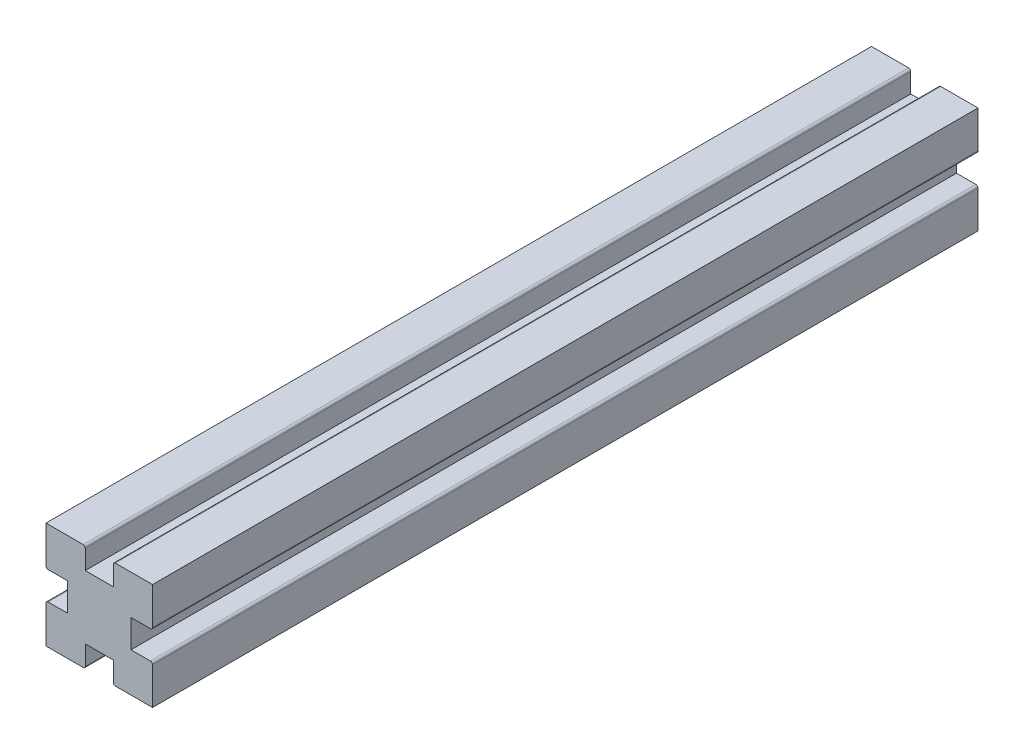
ISO-10303-21;
HEADER;
FILE_DESCRIPTION(('STEP AP214'),'2;1');
FILE_NAME('part.step','',(''),(''),'','','');
FILE_SCHEMA(('AUTOMOTIVE_DESIGN { 1 0 10303 214 1 1 1 1 }'));
ENDSEC;
DATA;
#1=APPLICATION_CONTEXT('core data for automotive mechanical design processes');
#2=APPLICATION_PROTOCOL_DEFINITION('international standard','automotive_design',2000,#1);
#3=PRODUCT_CONTEXT('',#1,'mechanical');
#4=PRODUCT('Part','Part','',(#3));
#5=PRODUCT_RELATED_PRODUCT_CATEGORY('part','',(#4));
#6=PRODUCT_DEFINITION_FORMATION('','',#4);
#7=PRODUCT_DEFINITION_CONTEXT('part definition',#1,'design');
#8=PRODUCT_DEFINITION('design','',#6,#7);
#9=PRODUCT_DEFINITION_SHAPE('','',#8);
#10=(LENGTH_UNIT() NAMED_UNIT(*) SI_UNIT(.MILLI.,.METRE.));
#11=(NAMED_UNIT(*) PLANE_ANGLE_UNIT() SI_UNIT($,.RADIAN.));
#12=(NAMED_UNIT(*) SI_UNIT($,.STERADIAN.) SOLID_ANGLE_UNIT());
#13=UNCERTAINTY_MEASURE_WITH_UNIT(LENGTH_MEASURE(1.E-05),#10,'distance_accuracy_value','');
#14=(GEOMETRIC_REPRESENTATION_CONTEXT(3) GLOBAL_UNCERTAINTY_ASSIGNED_CONTEXT((#13)) GLOBAL_UNIT_ASSIGNED_CONTEXT((#10,
#11,#12)) REPRESENTATION_CONTEXT('',''));
#15=CARTESIAN_POINT('',(0.,0.,0.));
#16=DIRECTION('',(0.,0.,1.));
#17=DIRECTION('',(1.,0.,0.));
#18=AXIS2_PLACEMENT_3D('',#15,#16,#17);
#19=CARTESIAN_POINT('',(-7.56816326530613,0.,196.85));
#20=DIRECTION('',(-1.,0.,0.));
#21=DIRECTION('',(0.,-1.,0.));
#22=AXIS2_PLACEMENT_3D('',#19,#20,#21);
#23=PLANE('',#22);
#24=DIRECTION('',(0.,1.,0.));
#25=VECTOR('',#24,1.);
#26=CARTESIAN_POINT('',(-7.56816326530613,0.,0.));
#27=LINE('',#26,#25);
#28=CARTESIAN_POINT('',(-7.56816326530616,-3.33999999999992,0.));
#29=VERTEX_POINT('',#28);
#30=CARTESIAN_POINT('',(-7.56816326530609,3.34000000000008,0.));
#31=VERTEX_POINT('',#30);
#32=EDGE_CURVE('E242',#29,#31,#27,.T.);
#33=ORIENTED_EDGE('',*,*,#32,.F.);
#34=DIRECTION('',(0.,0.,-1.));
#35=VECTOR('',#34,1.);
#36=CARTESIAN_POINT('',(-7.56816326530616,-3.33999999999992,196.85));
#37=LINE('',#36,#35);
#38=CARTESIAN_POINT('',(-7.56816326530616,-3.33999999999992,196.85));
#39=VERTEX_POINT('',#38);
#40=EDGE_CURVE('E229',#39,#29,#37,.T.);
#41=ORIENTED_EDGE('',*,*,#40,.F.);
#42=DIRECTION('',(0.,1.,0.));
#43=VECTOR('',#42,1.);
#44=CARTESIAN_POINT('',(-7.56816326530613,0.,196.85));
#45=LINE('',#44,#43);
#46=CARTESIAN_POINT('',(-7.56816326530609,3.34000000000008,196.85));
#47=VERTEX_POINT('',#46);
#48=EDGE_CURVE('E236',#39,#47,#45,.T.);
#49=ORIENTED_EDGE('',*,*,#48,.T.);
#50=DIRECTION('',(0.,0.,-1.));
#51=VECTOR('',#50,1.);
#52=CARTESIAN_POINT('',(-7.56816326530609,3.34000000000008,196.85));
#53=LINE('',#52,#51);
#54=EDGE_CURVE('E288',#47,#31,#53,.T.);
#55=ORIENTED_EDGE('',*,*,#54,.T.);
#56=EDGE_LOOP('',(#33,#41,#49,#55));
#57=FACE_BOUND('',#56,.T.);
#58=ADVANCED_FACE('F39',(#57),#23,.T.);
#59=CARTESIAN_POINT('',(0.,-3.34,196.85));
#60=DIRECTION('',(0.,1.,0.));
#61=DIRECTION('',(-1.,0.,0.));
#62=AXIS2_PLACEMENT_3D('',#59,#60,#61);
#63=PLANE('',#62);
#64=DIRECTION('',(1.,0.,0.));
#65=VECTOR('',#64,1.);
#66=CARTESIAN_POINT('',(0.,-3.34,0.));
#67=LINE('',#66,#65);
#68=CARTESIAN_POINT('',(-12.2,-3.33999999999987,0.));
#69=VERTEX_POINT('',#68);
#70=EDGE_CURVE('E290',#69,#29,#67,.T.);
#71=ORIENTED_EDGE('',*,*,#70,.F.);
#72=DIRECTION('',(0.,0.,-1.));
#73=VECTOR('',#72,1.);
#74=CARTESIAN_POINT('',(-12.2,-3.33999999999987,196.85));
#75=LINE('',#74,#73);
#76=CARTESIAN_POINT('',(-12.2,-3.33999999999987,196.85));
#77=VERTEX_POINT('',#76);
#78=EDGE_CURVE('E232',#69,#77,#75,.F.);
#79=ORIENTED_EDGE('',*,*,#78,.T.);
#80=DIRECTION('',(1.,0.,0.));
#81=VECTOR('',#80,1.);
#82=CARTESIAN_POINT('',(0.,-3.34,196.85));
#83=LINE('',#82,#81);
#84=EDGE_CURVE('E225',#77,#39,#83,.T.);
#85=ORIENTED_EDGE('',*,*,#84,.T.);
#86=ORIENTED_EDGE('',*,*,#40,.T.);
#87=EDGE_LOOP('',(#71,#79,#85,#86));
#88=FACE_BOUND('',#87,.T.);
#89=ADVANCED_FACE('F228',(#88),#63,.T.);
#90=CARTESIAN_POINT('',(-12.7,0.,196.85));
#91=DIRECTION('',(1.,0.,0.));
#92=DIRECTION('',(0.,1.,0.));
#93=AXIS2_PLACEMENT_3D('',#90,#91,#92);
#94=PLANE('',#93);
#95=DIRECTION('',(0.,-1.,0.));
#96=VECTOR('',#95,1.);
#97=CARTESIAN_POINT('',(-12.7,0.,196.85));
#98=LINE('',#97,#96);
#99=CARTESIAN_POINT('',(-12.7,-3.83999999999987,196.85));
#100=VERTEX_POINT('',#99);
#101=CARTESIAN_POINT('',(-12.7,-12.7,196.85));
#102=VERTEX_POINT('',#101);
#103=EDGE_CURVE('E235',#100,#102,#98,.T.);
#104=ORIENTED_EDGE('',*,*,#103,.F.);
#105=DIRECTION('',(0.,0.,-1.));
#106=VECTOR('',#105,1.);
#107=CARTESIAN_POINT('',(-12.7,-3.83999999999987,0.));
#108=LINE('',#107,#106);
#109=CARTESIAN_POINT('',(-12.7,-3.83999999999987,0.));
#110=VERTEX_POINT('',#109);
#111=EDGE_CURVE('E395',#100,#110,#108,.T.);
#112=ORIENTED_EDGE('',*,*,#111,.T.);
#113=DIRECTION('',(0.,-1.,0.));
#114=VECTOR('',#113,1.);
#115=CARTESIAN_POINT('',(-12.7,0.,0.));
#116=LINE('',#115,#114);
#117=CARTESIAN_POINT('',(-12.7,-12.7,0.));
#118=VERTEX_POINT('',#117);
#119=EDGE_CURVE('E292',#110,#118,#116,.T.);
#120=ORIENTED_EDGE('',*,*,#119,.T.);
#121=DIRECTION('',(0.,0.,-1.));
#122=VECTOR('',#121,1.);
#123=CARTESIAN_POINT('',(-12.7,-12.7,196.85));
#124=LINE('',#123,#122);
#125=EDGE_CURVE('E244',#102,#118,#124,.T.);
#126=ORIENTED_EDGE('',*,*,#125,.F.);
#127=EDGE_LOOP('',(#104,#112,#120,#126));
#128=FACE_BOUND('',#127,.T.);
#129=ADVANCED_FACE('F512',(#128),#94,.F.);
#130=CARTESIAN_POINT('',(0.,-12.7,196.85));
#131=DIRECTION('',(0.,1.,0.));
#132=DIRECTION('',(0.,0.,1.));
#133=AXIS2_PLACEMENT_3D('',#130,#131,#132);
#134=PLANE('',#133);
#135=DIRECTION('',(1.,0.,0.));
#136=VECTOR('',#135,1.);
#137=CARTESIAN_POINT('',(0.,-12.7,0.));
#138=LINE('',#137,#136);
#139=CARTESIAN_POINT('',(-3.83999999999981,-12.7,0.));
#140=VERTEX_POINT('',#139);
#141=EDGE_CURVE('E294',#118,#140,#138,.T.);
#142=ORIENTED_EDGE('',*,*,#141,.T.);
#143=DIRECTION('',(0.,0.,-1.));
#144=VECTOR('',#143,1.);
#145=CARTESIAN_POINT('',(-3.83999999999981,-12.7,196.85));
#146=LINE('',#145,#144);
#147=CARTESIAN_POINT('',(-3.83999999999981,-12.7,196.85));
#148=VERTEX_POINT('',#147);
#149=EDGE_CURVE('E373',#140,#148,#146,.F.);
#150=ORIENTED_EDGE('',*,*,#149,.T.);
#151=DIRECTION('',(1.,0.,0.));
#152=VECTOR('',#151,1.);
#153=CARTESIAN_POINT('',(0.,-12.7,196.85));
#154=LINE('',#153,#152);
#155=EDGE_CURVE('E256',#102,#148,#154,.T.);
#156=ORIENTED_EDGE('',*,*,#155,.F.);
#157=ORIENTED_EDGE('',*,*,#125,.T.);
#158=EDGE_LOOP('',(#142,#150,#156,#157));
#159=FACE_BOUND('',#158,.T.);
#160=ADVANCED_FACE('F519',(#159),#134,.F.);
#161=CARTESIAN_POINT('',(-3.34000000000046,-1.7782157377853E-13,196.85));
#162=DIRECTION('',(-1.,0.,0.));
#163=DIRECTION('',(0.,-1.,0.));
#164=AXIS2_PLACEMENT_3D('',#161,#162,#163);
#165=PLANE('',#164);
#166=DIRECTION('',(0.,1.,0.));
#167=VECTOR('',#166,1.);
#168=CARTESIAN_POINT('',(-3.34000000000046,-1.7782157377853E-13,196.85));
#169=LINE('',#168,#167);
#170=CARTESIAN_POINT('',(-3.33999999999981,-12.2,196.85));
#171=VERTEX_POINT('',#170);
#172=CARTESIAN_POINT('',(-3.34000000000005,-7.5681632653061,196.85));
#173=VERTEX_POINT('',#172);
#174=EDGE_CURVE('E259',#171,#173,#169,.T.);
#175=ORIENTED_EDGE('',*,*,#174,.F.);
#176=DIRECTION('',(0.,0.,-1.));
#177=VECTOR('',#176,1.);
#178=CARTESIAN_POINT('',(-3.33999999999981,-12.2,196.85));
#179=LINE('',#178,#177);
#180=CARTESIAN_POINT('',(-3.33999999999981,-12.2,0.));
#181=VERTEX_POINT('',#180);
#182=EDGE_CURVE('E243',#171,#181,#179,.T.);
#183=ORIENTED_EDGE('',*,*,#182,.T.);
#184=DIRECTION('',(0.,1.,0.));
#185=VECTOR('',#184,1.);
#186=CARTESIAN_POINT('',(-3.34000000000046,-1.7782157377853E-13,0.));
#187=LINE('',#186,#185);
#188=CARTESIAN_POINT('',(-3.34000000000005,-7.5681632653061,0.));
#189=VERTEX_POINT('',#188);
#190=EDGE_CURVE('E297',#181,#189,#187,.T.);
#191=ORIENTED_EDGE('',*,*,#190,.T.);
#192=DIRECTION('',(0.,0.,-1.));
#193=VECTOR('',#192,1.);
#194=CARTESIAN_POINT('',(-3.34000000000005,-7.5681632653061,196.85));
#195=LINE('',#194,#193);
#196=EDGE_CURVE('E350',#173,#189,#195,.T.);
#197=ORIENTED_EDGE('',*,*,#196,.F.);
#198=EDGE_LOOP('',(#175,#183,#191,#197));
#199=FACE_BOUND('',#198,.T.);
#200=ADVANCED_FACE('F515',(#199),#165,.F.);
#201=CARTESIAN_POINT('',(0.,-7.56816326530607,196.85));
#202=DIRECTION('',(0.,-1.,0.));
#203=DIRECTION('',(1.,0.,0.));
#204=AXIS2_PLACEMENT_3D('',#201,#202,#203);
#205=PLANE('',#204);
#206=DIRECTION('',(-1.,0.,0.));
#207=VECTOR('',#206,1.);
#208=CARTESIAN_POINT('',(0.,-7.56816326530607,0.));
#209=LINE('',#208,#207);
#210=CARTESIAN_POINT('',(3.34000000000022,-7.56816326530604,0.));
#211=VERTEX_POINT('',#210);
#212=EDGE_CURVE('E300',#211,#189,#209,.T.);
#213=ORIENTED_EDGE('',*,*,#212,.F.);
#214=DIRECTION('',(0.,0.,-1.));
#215=VECTOR('',#214,1.);
#216=CARTESIAN_POINT('',(3.34000000000022,-7.56816326530604,196.85));
#217=LINE('',#216,#215);
#218=CARTESIAN_POINT('',(3.34000000000022,-7.56816326530604,196.85));
#219=VERTEX_POINT('',#218);
#220=EDGE_CURVE('E347',#219,#211,#217,.T.);
#221=ORIENTED_EDGE('',*,*,#220,.F.);
#222=DIRECTION('',(-1.,0.,0.));
#223=VECTOR('',#222,1.);
#224=CARTESIAN_POINT('',(0.,-7.56816326530607,196.85));
#225=LINE('',#224,#223);
#226=EDGE_CURVE('E262',#219,#173,#225,.T.);
#227=ORIENTED_EDGE('',*,*,#226,.T.);
#228=ORIENTED_EDGE('',*,*,#196,.T.);
#229=EDGE_LOOP('',(#213,#221,#227,#228));
#230=FACE_BOUND('',#229,.T.);
#231=ADVANCED_FACE('F518',(#230),#205,.T.);
#232=CARTESIAN_POINT('',(3.34000000000022,0.,196.85));
#233=DIRECTION('',(-1.,0.,0.));
#234=DIRECTION('',(0.,-1.,0.));
#235=AXIS2_PLACEMENT_3D('',#232,#233,#234);
#236=PLANE('',#235);
#237=DIRECTION('',(0.,1.,0.));
#238=VECTOR('',#237,1.);
#239=CARTESIAN_POINT('',(3.34000000000022,0.,0.));
#240=LINE('',#239,#238);
#241=CARTESIAN_POINT('',(3.34000000000022,-12.2,0.));
#242=VERTEX_POINT('',#241);
#243=EDGE_CURVE('E303',#242,#211,#240,.T.);
#244=ORIENTED_EDGE('',*,*,#243,.F.);
#245=DIRECTION('',(0.,0.,-1.));
#246=VECTOR('',#245,1.);
#247=CARTESIAN_POINT('',(3.34000000000022,-12.2,196.85));
#248=LINE('',#247,#246);
#249=CARTESIAN_POINT('',(3.34000000000022,-12.2,196.85));
#250=VERTEX_POINT('',#249);
#251=EDGE_CURVE('E393',#242,#250,#248,.F.);
#252=ORIENTED_EDGE('',*,*,#251,.T.);
#253=DIRECTION('',(0.,1.,0.));
#254=VECTOR('',#253,1.);
#255=CARTESIAN_POINT('',(3.34000000000022,0.,196.85));
#256=LINE('',#255,#254);
#257=EDGE_CURVE('E265',#250,#219,#256,.T.);
#258=ORIENTED_EDGE('',*,*,#257,.T.);
#259=ORIENTED_EDGE('',*,*,#220,.T.);
#260=EDGE_LOOP('',(#244,#252,#258,#259));
#261=FACE_BOUND('',#260,.T.);
#262=ADVANCED_FACE('F490',(#261),#236,.T.);
#263=CARTESIAN_POINT('',(3.84000000000022,-12.7,196.85));
#264=VERTEX_POINT('',#263);
#265=CARTESIAN_POINT('',(12.7,-12.7,196.85));
#266=VERTEX_POINT('',#265);
#267=EDGE_CURVE('E260',#264,#266,#154,.T.);
#268=ORIENTED_EDGE('',*,*,#267,.F.);
#269=DIRECTION('',(0.,0.,-1.));
#270=VECTOR('',#269,1.);
#271=CARTESIAN_POINT('',(3.84000000000022,-12.7,0.));
#272=LINE('',#271,#270);
#273=CARTESIAN_POINT('',(3.84000000000022,-12.7,0.));
#274=VERTEX_POINT('',#273);
#275=EDGE_CURVE('E390',#264,#274,#272,.T.);
#276=ORIENTED_EDGE('',*,*,#275,.T.);
#277=CARTESIAN_POINT('',(12.7,-12.7,0.));
#278=VERTEX_POINT('',#277);
#279=EDGE_CURVE('E298',#274,#278,#138,.T.);
#280=ORIENTED_EDGE('',*,*,#279,.T.);
#281=DIRECTION('',(0.,0.,-1.));
#282=VECTOR('',#281,1.);
#283=CARTESIAN_POINT('',(12.7,-12.7,196.85));
#284=LINE('',#283,#282);
#285=EDGE_CURVE('E344',#266,#278,#284,.T.);
#286=ORIENTED_EDGE('',*,*,#285,.F.);
#287=EDGE_LOOP('',(#268,#276,#280,#286));
#288=FACE_BOUND('',#287,.T.);
#289=ADVANCED_FACE('F484',(#288),#134,.F.);
#290=CARTESIAN_POINT('',(12.7,0.,196.85));
#291=DIRECTION('',(1.,0.,0.));
#292=DIRECTION('',(0.,0.,-1.));
#293=AXIS2_PLACEMENT_3D('',#290,#291,#292);
#294=PLANE('',#293);
#295=DIRECTION('',(0.,-1.,0.));
#296=VECTOR('',#295,1.);
#297=CARTESIAN_POINT('',(12.7,0.,0.));
#298=LINE('',#297,#296);
#299=CARTESIAN_POINT('',(12.7,-3.84000000000004,0.));
#300=VERTEX_POINT('',#299);
#301=EDGE_CURVE('E305',#300,#278,#298,.T.);
#302=ORIENTED_EDGE('',*,*,#301,.F.);
#303=DIRECTION('',(0.,0.,-1.));
#304=VECTOR('',#303,1.);
#305=CARTESIAN_POINT('',(12.7,-3.84000000000004,196.85));
#306=LINE('',#305,#304);
#307=CARTESIAN_POINT('',(12.7,-3.84000000000004,196.85));
#308=VERTEX_POINT('',#307);
#309=EDGE_CURVE('E411',#300,#308,#306,.F.);
#310=ORIENTED_EDGE('',*,*,#309,.T.);
#311=DIRECTION('',(0.,-1.,0.));
#312=VECTOR('',#311,1.);
#313=CARTESIAN_POINT('',(12.7,0.,196.85));
#314=LINE('',#313,#312);
#315=EDGE_CURVE('E267',#308,#266,#314,.T.);
#316=ORIENTED_EDGE('',*,*,#315,.T.);
#317=ORIENTED_EDGE('',*,*,#285,.T.);
#318=EDGE_LOOP('',(#302,#310,#316,#317));
#319=FACE_BOUND('',#318,.T.);
#320=ADVANCED_FACE('F476',(#319),#294,.T.);
#321=CARTESIAN_POINT('',(0.,-3.34,196.85));
#322=DIRECTION('',(0.,-1.,0.));
#323=DIRECTION('',(1.,0.,0.));
#324=AXIS2_PLACEMENT_3D('',#321,#322,#323);
#325=PLANE('',#324);
#326=DIRECTION('',(-1.,0.,0.));
#327=VECTOR('',#326,1.);
#328=CARTESIAN_POINT('',(0.,-3.34,196.85));
#329=LINE('',#328,#327);
#330=CARTESIAN_POINT('',(12.2,-3.34000000000004,196.85));
#331=VERTEX_POINT('',#330);
#332=CARTESIAN_POINT('',(7.56816326530612,-3.34000000000003,196.85));
#333=VERTEX_POINT('',#332);
#334=EDGE_CURVE('E269',#331,#333,#329,.T.);
#335=ORIENTED_EDGE('',*,*,#334,.F.);
#336=DIRECTION('',(0.,0.,-1.));
#337=VECTOR('',#336,1.);
#338=CARTESIAN_POINT('',(12.2,-3.34000000000004,0.));
#339=LINE('',#338,#337);
#340=CARTESIAN_POINT('',(12.2,-3.34000000000004,0.));
#341=VERTEX_POINT('',#340);
#342=EDGE_CURVE('E408',#331,#341,#339,.T.);
#343=ORIENTED_EDGE('',*,*,#342,.T.);
#344=DIRECTION('',(-1.,0.,0.));
#345=VECTOR('',#344,1.);
#346=CARTESIAN_POINT('',(0.,-3.34,0.));
#347=LINE('',#346,#345);
#348=CARTESIAN_POINT('',(7.56816326530612,-3.34000000000003,0.));
#349=VERTEX_POINT('',#348);
#350=EDGE_CURVE('E308',#341,#349,#347,.T.);
#351=ORIENTED_EDGE('',*,*,#350,.T.);
#352=DIRECTION('',(0.,0.,-1.));
#353=VECTOR('',#352,1.);
#354=CARTESIAN_POINT('',(7.56816326530612,-3.34000000000003,196.85));
#355=LINE('',#354,#353);
#356=EDGE_CURVE('E341',#333,#349,#355,.T.);
#357=ORIENTED_EDGE('',*,*,#356,.F.);
#358=EDGE_LOOP('',(#335,#343,#351,#357));
#359=FACE_BOUND('',#358,.T.);
#360=ADVANCED_FACE('F468',(#359),#325,.F.);
#361=CARTESIAN_POINT('',(7.56816326530613,0.,196.85));
#362=DIRECTION('',(1.,0.,0.));
#363=DIRECTION('',(0.,1.,0.));
#364=AXIS2_PLACEMENT_3D('',#361,#362,#363);
#365=PLANE('',#364);
#366=DIRECTION('',(0.,-1.,0.));
#367=VECTOR('',#366,1.);
#368=CARTESIAN_POINT('',(7.56816326530613,0.,0.));
#369=LINE('',#368,#367);
#370=CARTESIAN_POINT('',(7.56816326530614,3.33999999999997,0.));
#371=VERTEX_POINT('',#370);
#372=EDGE_CURVE('E311',#371,#349,#369,.T.);
#373=ORIENTED_EDGE('',*,*,#372,.F.);
#374=DIRECTION('',(0.,0.,-1.));
#375=VECTOR('',#374,1.);
#376=CARTESIAN_POINT('',(7.56816326530614,3.33999999999997,196.85));
#377=LINE('',#376,#375);
#378=CARTESIAN_POINT('',(7.56816326530614,3.33999999999997,196.85));
#379=VERTEX_POINT('',#378);
#380=EDGE_CURVE('E338',#379,#371,#377,.T.);
#381=ORIENTED_EDGE('',*,*,#380,.F.);
#382=DIRECTION('',(0.,-1.,0.));
#383=VECTOR('',#382,1.);
#384=CARTESIAN_POINT('',(7.56816326530613,0.,196.85));
#385=LINE('',#384,#383);
#386=EDGE_CURVE('E272',#379,#333,#385,.T.);
#387=ORIENTED_EDGE('',*,*,#386,.T.);
#388=ORIENTED_EDGE('',*,*,#356,.T.);
#389=EDGE_LOOP('',(#373,#381,#387,#388));
#390=FACE_BOUND('',#389,.T.);
#391=ADVANCED_FACE('F464',(#390),#365,.T.);
#392=CARTESIAN_POINT('',(0.,3.34,196.85));
#393=DIRECTION('',(0.,-1.,0.));
#394=DIRECTION('',(1.,0.,0.));
#395=AXIS2_PLACEMENT_3D('',#392,#393,#394);
#396=PLANE('',#395);
#397=DIRECTION('',(-1.,0.,0.));
#398=VECTOR('',#397,1.);
#399=CARTESIAN_POINT('',(0.,3.34,0.));
#400=LINE('',#399,#398);
#401=CARTESIAN_POINT('',(12.2,3.33999999999996,0.));
#402=VERTEX_POINT('',#401);
#403=EDGE_CURVE('E314',#402,#371,#400,.T.);
#404=ORIENTED_EDGE('',*,*,#403,.F.);
#405=DIRECTION('',(0.,0.,-1.));
#406=VECTOR('',#405,1.);
#407=CARTESIAN_POINT('',(12.2,3.33999999999996,196.85));
#408=LINE('',#407,#406);
#409=CARTESIAN_POINT('',(12.2,3.33999999999996,196.85));
#410=VERTEX_POINT('',#409);
#411=EDGE_CURVE('E406',#402,#410,#408,.F.);
#412=ORIENTED_EDGE('',*,*,#411,.T.);
#413=DIRECTION('',(-1.,0.,0.));
#414=VECTOR('',#413,1.);
#415=CARTESIAN_POINT('',(0.,3.34,196.85));
#416=LINE('',#415,#414);
#417=EDGE_CURVE('E275',#410,#379,#416,.T.);
#418=ORIENTED_EDGE('',*,*,#417,.T.);
#419=ORIENTED_EDGE('',*,*,#380,.T.);
#420=EDGE_LOOP('',(#404,#412,#418,#419));
#421=FACE_BOUND('',#420,.T.);
#422=ADVANCED_FACE('F457',(#421),#396,.T.);
#423=CARTESIAN_POINT('',(12.7,12.7,196.85));
#424=VERTEX_POINT('',#423);
#425=CARTESIAN_POINT('',(12.7,3.83999999999996,196.85));
#426=VERTEX_POINT('',#425);
#427=EDGE_CURVE('E270',#424,#426,#314,.T.);
#428=ORIENTED_EDGE('',*,*,#427,.T.);
#429=DIRECTION('',(0.,0.,-1.));
#430=VECTOR('',#429,1.);
#431=CARTESIAN_POINT('',(12.7,3.83999999999996,196.85));
#432=LINE('',#431,#430);
#433=CARTESIAN_POINT('',(12.7,3.83999999999996,0.));
#434=VERTEX_POINT('',#433);
#435=EDGE_CURVE('E403',#426,#434,#432,.T.);
#436=ORIENTED_EDGE('',*,*,#435,.T.);
#437=CARTESIAN_POINT('',(12.7,12.7,0.));
#438=VERTEX_POINT('',#437);
#439=EDGE_CURVE('E309',#438,#434,#298,.T.);
#440=ORIENTED_EDGE('',*,*,#439,.F.);
#441=DIRECTION('',(0.,0.,-1.));
#442=VECTOR('',#441,1.);
#443=CARTESIAN_POINT('',(12.7,12.7,196.85));
#444=LINE('',#443,#442);
#445=EDGE_CURVE('E335',#424,#438,#444,.T.);
#446=ORIENTED_EDGE('',*,*,#445,.F.);
#447=EDGE_LOOP('',(#428,#436,#440,#446));
#448=FACE_BOUND('',#447,.T.);
#449=ADVANCED_FACE('F449',(#448),#294,.T.);
#450=CARTESIAN_POINT('',(0.,12.7,196.85));
#451=DIRECTION('',(0.,1.,0.));
#452=DIRECTION('',(0.,0.,1.));
#453=AXIS2_PLACEMENT_3D('',#450,#451,#452);
#454=PLANE('',#453);
#455=DIRECTION('',(1.,0.,0.));
#456=VECTOR('',#455,1.);
#457=CARTESIAN_POINT('',(0.,12.7,0.));
#458=LINE('',#457,#456);
#459=CARTESIAN_POINT('',(3.84,12.7,0.));
#460=VERTEX_POINT('',#459);
#461=EDGE_CURVE('E316',#460,#438,#458,.T.);
#462=ORIENTED_EDGE('',*,*,#461,.F.);
#463=DIRECTION('',(0.,0.,-1.));
#464=VECTOR('',#463,1.);
#465=CARTESIAN_POINT('',(3.84,12.7,196.85));
#466=LINE('',#465,#464);
#467=CARTESIAN_POINT('',(3.84,12.7,196.85));
#468=VERTEX_POINT('',#467);
#469=EDGE_CURVE('E11',#460,#468,#466,.F.);
#470=ORIENTED_EDGE('',*,*,#469,.T.);
#471=DIRECTION('',(1.,0.,0.));
#472=VECTOR('',#471,1.);
#473=CARTESIAN_POINT('',(0.,12.7,196.85));
#474=LINE('',#473,#472);
#475=EDGE_CURVE('E277',#468,#424,#474,.T.);
#476=ORIENTED_EDGE('',*,*,#475,.T.);
#477=ORIENTED_EDGE('',*,*,#445,.T.);
#478=EDGE_LOOP('',(#462,#470,#476,#477));
#479=FACE_BOUND('',#478,.T.);
#480=ADVANCED_FACE('F442',(#479),#454,.T.);
#481=CARTESIAN_POINT('',(3.34,0.,196.85));
#482=DIRECTION('',(1.,0.,0.));
#483=DIRECTION('',(0.,1.,0.));
#484=AXIS2_PLACEMENT_3D('',#481,#482,#483);
#485=PLANE('',#484);
#486=DIRECTION('',(0.,-1.,0.));
#487=VECTOR('',#486,1.);
#488=CARTESIAN_POINT('',(3.34,0.,196.85));
#489=LINE('',#488,#487);
#490=CARTESIAN_POINT('',(3.34,12.2,196.85));
#491=VERTEX_POINT('',#490);
#492=CARTESIAN_POINT('',(3.34,7.56816326530613,196.85));
#493=VERTEX_POINT('',#492);
#494=EDGE_CURVE('E279',#491,#493,#489,.T.);
#495=ORIENTED_EDGE('',*,*,#494,.F.);
#496=DIRECTION('',(0.,0.,-1.));
#497=VECTOR('',#496,1.);
#498=CARTESIAN_POINT('',(3.34,12.2,0.));
#499=LINE('',#498,#497);
#500=CARTESIAN_POINT('',(3.34,12.2,0.));
#501=VERTEX_POINT('',#500);
#502=EDGE_CURVE('E47',#491,#501,#499,.T.);
#503=ORIENTED_EDGE('',*,*,#502,.T.);
#504=DIRECTION('',(0.,-1.,0.));
#505=VECTOR('',#504,1.);
#506=CARTESIAN_POINT('',(3.34,0.,0.));
#507=LINE('',#506,#505);
#508=CARTESIAN_POINT('',(3.34,7.56816326530613,0.));
#509=VERTEX_POINT('',#508);
#510=EDGE_CURVE('E318',#501,#509,#507,.T.);
#511=ORIENTED_EDGE('',*,*,#510,.T.);
#512=DIRECTION('',(0.,0.,-1.));
#513=VECTOR('',#512,1.);
#514=CARTESIAN_POINT('',(3.34,7.56816326530613,196.85));
#515=LINE('',#514,#513);
#516=EDGE_CURVE('E332',#493,#509,#515,.T.);
#517=ORIENTED_EDGE('',*,*,#516,.F.);
#518=EDGE_LOOP('',(#495,#503,#511,#517));
#519=FACE_BOUND('',#518,.T.);
#520=ADVANCED_FACE('F422',(#519),#485,.F.);
#521=CARTESIAN_POINT('',(0.,7.56816326530613,196.85));
#522=DIRECTION('',(0.,1.,0.));
#523=DIRECTION('',(-1.,0.,0.));
#524=AXIS2_PLACEMENT_3D('',#521,#522,#523);
#525=PLANE('',#524);
#526=DIRECTION('',(1.,0.,0.));
#527=VECTOR('',#526,1.);
#528=CARTESIAN_POINT('',(0.,7.56816326530613,0.));
#529=LINE('',#528,#527);
#530=CARTESIAN_POINT('',(-3.34,7.56816326530613,0.));
#531=VERTEX_POINT('',#530);
#532=EDGE_CURVE('E321',#531,#509,#529,.T.);
#533=ORIENTED_EDGE('',*,*,#532,.F.);
#534=DIRECTION('',(0.,0.,-1.));
#535=VECTOR('',#534,1.);
#536=CARTESIAN_POINT('',(-3.34,7.56816326530613,196.85));
#537=LINE('',#536,#535);
#538=CARTESIAN_POINT('',(-3.34,7.56816326530613,196.85));
#539=VERTEX_POINT('',#538);
#540=EDGE_CURVE('E329',#539,#531,#537,.T.);
#541=ORIENTED_EDGE('',*,*,#540,.F.);
#542=DIRECTION('',(1.,0.,0.));
#543=VECTOR('',#542,1.);
#544=CARTESIAN_POINT('',(0.,7.56816326530613,196.85));
#545=LINE('',#544,#543);
#546=EDGE_CURVE('E282',#539,#493,#545,.T.);
#547=ORIENTED_EDGE('',*,*,#546,.T.);
#548=ORIENTED_EDGE('',*,*,#516,.T.);
#549=EDGE_LOOP('',(#533,#541,#547,#548));
#550=FACE_BOUND('',#549,.T.);
#551=ADVANCED_FACE('F434',(#550),#525,.T.);
#552=CARTESIAN_POINT('',(-3.34,0.,196.85));
#553=DIRECTION('',(1.,0.,0.));
#554=DIRECTION('',(0.,1.,0.));
#555=AXIS2_PLACEMENT_3D('',#552,#553,#554);
#556=PLANE('',#555);
#557=DIRECTION('',(0.,-1.,0.));
#558=VECTOR('',#557,1.);
#559=CARTESIAN_POINT('',(-3.34,0.,0.));
#560=LINE('',#559,#558);
#561=CARTESIAN_POINT('',(-3.34,12.2,0.));
#562=VERTEX_POINT('',#561);
#563=EDGE_CURVE('E324',#562,#531,#560,.T.);
#564=ORIENTED_EDGE('',*,*,#563,.F.);
#565=DIRECTION('',(0.,0.,-1.));
#566=VECTOR('',#565,1.);
#567=CARTESIAN_POINT('',(-3.34,12.2,196.85));
#568=LINE('',#567,#566);
#569=CARTESIAN_POINT('',(-3.34,12.2,196.85));
#570=VERTEX_POINT('',#569);
#571=EDGE_CURVE('E416',#562,#570,#568,.F.);
#572=ORIENTED_EDGE('',*,*,#571,.T.);
#573=DIRECTION('',(0.,-1.,0.));
#574=VECTOR('',#573,1.);
#575=CARTESIAN_POINT('',(-3.34,0.,196.85));
#576=LINE('',#575,#574);
#577=EDGE_CURVE('E285',#570,#539,#576,.T.);
#578=ORIENTED_EDGE('',*,*,#577,.T.);
#579=ORIENTED_EDGE('',*,*,#540,.T.);
#580=EDGE_LOOP('',(#564,#572,#578,#579));
#581=FACE_BOUND('',#580,.T.);
#582=ADVANCED_FACE('F540',(#581),#556,.T.);
#583=CARTESIAN_POINT('',(-12.7,12.7,196.85));
#584=VERTEX_POINT('',#583);
#585=CARTESIAN_POINT('',(-3.84,12.7,196.85));
#586=VERTEX_POINT('',#585);
#587=EDGE_CURVE('E280',#584,#586,#474,.T.);
#588=ORIENTED_EDGE('',*,*,#587,.T.);
#589=DIRECTION('',(0.,0.,-1.));
#590=VECTOR('',#589,1.);
#591=CARTESIAN_POINT('',(-3.84,12.7,196.85));
#592=LINE('',#591,#590);
#593=CARTESIAN_POINT('',(-3.84,12.7,0.));
#594=VERTEX_POINT('',#593);
#595=EDGE_CURVE('E413',#586,#594,#592,.T.);
#596=ORIENTED_EDGE('',*,*,#595,.T.);
#597=CARTESIAN_POINT('',(-12.7,12.7,0.));
#598=VERTEX_POINT('',#597);
#599=EDGE_CURVE('E319',#598,#594,#458,.T.);
#600=ORIENTED_EDGE('',*,*,#599,.F.);
#601=DIRECTION('',(0.,0.,-1.));
#602=VECTOR('',#601,1.);
#603=CARTESIAN_POINT('',(-12.7,12.7,196.85));
#604=LINE('',#603,#602);
#605=EDGE_CURVE('E327',#584,#598,#604,.T.);
#606=ORIENTED_EDGE('',*,*,#605,.F.);
#607=EDGE_LOOP('',(#588,#596,#600,#606));
#608=FACE_BOUND('',#607,.T.);
#609=ADVANCED_FACE('F543',(#608),#454,.T.);
#610=CARTESIAN_POINT('',(-12.7,3.84000000000013,0.));
#611=VERTEX_POINT('',#610);
#612=EDGE_CURVE('E252',#598,#611,#116,.T.);
#613=ORIENTED_EDGE('',*,*,#612,.T.);
#614=DIRECTION('',(0.,0.,-1.));
#615=VECTOR('',#614,1.);
#616=CARTESIAN_POINT('',(-12.7,3.84000000000013,196.85));
#617=LINE('',#616,#615);
#618=CARTESIAN_POINT('',(-12.7,3.84000000000013,196.85));
#619=VERTEX_POINT('',#618);
#620=EDGE_CURVE('E62',#611,#619,#617,.F.);
#621=ORIENTED_EDGE('',*,*,#620,.T.);
#622=EDGE_CURVE('E257',#584,#619,#98,.T.);
#623=ORIENTED_EDGE('',*,*,#622,.F.);
#624=ORIENTED_EDGE('',*,*,#605,.T.);
#625=EDGE_LOOP('',(#613,#621,#623,#624));
#626=FACE_BOUND('',#625,.T.);
#627=ADVANCED_FACE('F547',(#626),#94,.F.);
#628=CARTESIAN_POINT('',(0.,3.34,196.85));
#629=DIRECTION('',(0.,1.,0.));
#630=DIRECTION('',(-1.,0.,0.));
#631=AXIS2_PLACEMENT_3D('',#628,#629,#630);
#632=PLANE('',#631);
#633=DIRECTION('',(1.,0.,0.));
#634=VECTOR('',#633,1.);
#635=CARTESIAN_POINT('',(0.,3.34,196.85));
#636=LINE('',#635,#634);
#637=CARTESIAN_POINT('',(-12.2,3.34000000000013,196.85));
#638=VERTEX_POINT('',#637);
#639=EDGE_CURVE('E248',#638,#47,#636,.T.);
#640=ORIENTED_EDGE('',*,*,#639,.F.);
#641=DIRECTION('',(0.,0.,-1.));
#642=VECTOR('',#641,1.);
#643=CARTESIAN_POINT('',(-12.2,3.34000000000013,196.85));
#644=LINE('',#643,#642);
#645=CARTESIAN_POINT('',(-12.2,3.34000000000013,0.));
#646=VERTEX_POINT('',#645);
#647=EDGE_CURVE('E399',#638,#646,#644,.T.);
#648=ORIENTED_EDGE('',*,*,#647,.T.);
#649=DIRECTION('',(1.,0.,0.));
#650=VECTOR('',#649,1.);
#651=CARTESIAN_POINT('',(0.,3.34,0.));
#652=LINE('',#651,#650);
#653=EDGE_CURVE('E250',#646,#31,#652,.T.);
#654=ORIENTED_EDGE('',*,*,#653,.T.);
#655=ORIENTED_EDGE('',*,*,#54,.F.);
#656=EDGE_LOOP('',(#640,#648,#654,#655));
#657=FACE_BOUND('',#656,.T.);
#658=ADVANCED_FACE('F551',(#657),#632,.F.);
#659=CARTESIAN_POINT('',(0.,0.,196.85));
#660=DIRECTION('',(0.,0.,1.));
#661=DIRECTION('',(1.,0.,0.));
#662=AXIS2_PLACEMENT_3D('',#659,#660,#661);
#663=PLANE('',#662);
#664=ORIENTED_EDGE('',*,*,#155,.T.);
#665=CARTESIAN_POINT('',(-3.83999999999981,-12.2,196.85));
#666=DIRECTION('',(0.,0.,1.));
#667=DIRECTION('',(1.,0.,0.));
#668=AXIS2_PLACEMENT_3D('',#665,#666,#667);
#669=CIRCLE('',#668,0.5);
#670=EDGE_CURVE('E388',#148,#171,#669,.T.);
#671=ORIENTED_EDGE('',*,*,#670,.T.);
#672=ORIENTED_EDGE('',*,*,#174,.T.);
#673=ORIENTED_EDGE('',*,*,#226,.F.);
#674=ORIENTED_EDGE('',*,*,#257,.F.);
#675=CARTESIAN_POINT('',(3.84000000000022,-12.2,196.85));
#676=DIRECTION('',(0.,0.,1.));
#677=DIRECTION('',(1.,0.,0.));
#678=AXIS2_PLACEMENT_3D('',#675,#676,#677);
#679=CIRCLE('',#678,0.5);
#680=EDGE_CURVE('E386',#250,#264,#679,.T.);
#681=ORIENTED_EDGE('',*,*,#680,.T.);
#682=ORIENTED_EDGE('',*,*,#267,.T.);
#683=ORIENTED_EDGE('',*,*,#315,.F.);
#684=CARTESIAN_POINT('',(12.2,-3.84000000000004,196.85));
#685=DIRECTION('',(0.,0.,1.));
#686=DIRECTION('',(1.,0.,0.));
#687=AXIS2_PLACEMENT_3D('',#684,#685,#686);
#688=CIRCLE('',#687,0.5);
#689=EDGE_CURVE('E379',#308,#331,#688,.T.);
#690=ORIENTED_EDGE('',*,*,#689,.T.);
#691=ORIENTED_EDGE('',*,*,#334,.T.);
#692=ORIENTED_EDGE('',*,*,#386,.F.);
#693=ORIENTED_EDGE('',*,*,#417,.F.);
#694=CARTESIAN_POINT('',(12.2,3.83999999999996,196.85));
#695=DIRECTION('',(0.,0.,1.));
#696=DIRECTION('',(1.,0.,0.));
#697=AXIS2_PLACEMENT_3D('',#694,#695,#696);
#698=CIRCLE('',#697,0.5);
#699=EDGE_CURVE('E381',#410,#426,#698,.T.);
#700=ORIENTED_EDGE('',*,*,#699,.T.);
#701=ORIENTED_EDGE('',*,*,#427,.F.);
#702=ORIENTED_EDGE('',*,*,#475,.F.);
#703=CARTESIAN_POINT('',(3.84,12.2,196.85));
#704=DIRECTION('',(0.,0.,1.));
#705=DIRECTION('',(1.,0.,0.));
#706=AXIS2_PLACEMENT_3D('',#703,#704,#705);
#707=CIRCLE('',#706,0.5);
#708=EDGE_CURVE('E375',#468,#491,#707,.T.);
#709=ORIENTED_EDGE('',*,*,#708,.T.);
#710=ORIENTED_EDGE('',*,*,#494,.T.);
#711=ORIENTED_EDGE('',*,*,#546,.F.);
#712=ORIENTED_EDGE('',*,*,#577,.F.);
#713=CARTESIAN_POINT('',(-3.84,12.2,196.85));
#714=DIRECTION('',(0.,0.,1.));
#715=DIRECTION('',(1.,0.,0.));
#716=AXIS2_PLACEMENT_3D('',#713,#714,#715);
#717=CIRCLE('',#716,0.5);
#718=EDGE_CURVE('E377',#570,#586,#717,.T.);
#719=ORIENTED_EDGE('',*,*,#718,.T.);
#720=ORIENTED_EDGE('',*,*,#587,.F.);
#721=ORIENTED_EDGE('',*,*,#622,.T.);
#722=CARTESIAN_POINT('',(-12.2,3.84000000000013,196.85));
#723=DIRECTION('',(0.,0.,1.));
#724=DIRECTION('',(1.,0.,0.));
#725=AXIS2_PLACEMENT_3D('',#722,#723,#724);
#726=CIRCLE('',#725,0.5);
#727=EDGE_CURVE('E54',#619,#638,#726,.T.);
#728=ORIENTED_EDGE('',*,*,#727,.T.);
#729=ORIENTED_EDGE('',*,*,#639,.T.);
#730=ORIENTED_EDGE('',*,*,#48,.F.);
#731=ORIENTED_EDGE('',*,*,#84,.F.);
#732=CARTESIAN_POINT('',(-12.2,-3.83999999999987,196.85));
#733=DIRECTION('',(0.,0.,1.));
#734=DIRECTION('',(1.,0.,0.));
#735=AXIS2_PLACEMENT_3D('',#732,#733,#734);
#736=CIRCLE('',#735,0.5);
#737=EDGE_CURVE('E384',#77,#100,#736,.T.);
#738=ORIENTED_EDGE('',*,*,#737,.T.);
#739=ORIENTED_EDGE('',*,*,#103,.T.);
#740=EDGE_LOOP('',(#664,#671,#672,#673,#674,#681,#682,#683,#690,#691,#692,#693,#700,#701,#702,
#709,#710,#711,#712,#719,#720,#721,#728,#729,#730,#731,#738,#739));
#741=FACE_BOUND('',#740,.T.);
#742=ADVANCED_FACE('F247',(#741),#663,.T.);
#743=CARTESIAN_POINT('',(0.,0.,0.));
#744=DIRECTION('',(0.,0.,1.));
#745=DIRECTION('',(1.,0.,0.));
#746=AXIS2_PLACEMENT_3D('',#743,#744,#745);
#747=PLANE('',#746);
#748=ORIENTED_EDGE('',*,*,#190,.F.);
#749=CARTESIAN_POINT('',(-3.83999999999981,-12.2,0.));
#750=DIRECTION('',(0.,0.,1.));
#751=DIRECTION('',(1.,0.,0.));
#752=AXIS2_PLACEMENT_3D('',#749,#750,#751);
#753=CIRCLE('',#752,0.5);
#754=EDGE_CURVE('E371',#181,#140,#753,.F.);
#755=ORIENTED_EDGE('',*,*,#754,.T.);
#756=ORIENTED_EDGE('',*,*,#141,.F.);
#757=ORIENTED_EDGE('',*,*,#119,.F.);
#758=CARTESIAN_POINT('',(-12.2,-3.83999999999987,0.));
#759=DIRECTION('',(0.,0.,1.));
#760=DIRECTION('',(1.,0.,0.));
#761=AXIS2_PLACEMENT_3D('',#758,#759,#760);
#762=CIRCLE('',#761,0.5);
#763=EDGE_CURVE('E367',#110,#69,#762,.F.);
#764=ORIENTED_EDGE('',*,*,#763,.T.);
#765=ORIENTED_EDGE('',*,*,#70,.T.);
#766=ORIENTED_EDGE('',*,*,#32,.T.);
#767=ORIENTED_EDGE('',*,*,#653,.F.);
#768=CARTESIAN_POINT('',(-12.2,3.84000000000013,0.));
#769=DIRECTION('',(0.,0.,1.));
#770=DIRECTION('',(1.,0.,0.));
#771=AXIS2_PLACEMENT_3D('',#768,#769,#770);
#772=CIRCLE('',#771,0.5);
#773=EDGE_CURVE('E365',#646,#611,#772,.F.);
#774=ORIENTED_EDGE('',*,*,#773,.T.);
#775=ORIENTED_EDGE('',*,*,#612,.F.);
#776=ORIENTED_EDGE('',*,*,#599,.T.);
#777=CARTESIAN_POINT('',(-3.84,12.2,0.));
#778=DIRECTION('',(0.,0.,1.));
#779=DIRECTION('',(1.,0.,0.));
#780=AXIS2_PLACEMENT_3D('',#777,#778,#779);
#781=CIRCLE('',#780,0.5);
#782=EDGE_CURVE('E359',#594,#562,#781,.F.);
#783=ORIENTED_EDGE('',*,*,#782,.T.);
#784=ORIENTED_EDGE('',*,*,#563,.T.);
#785=ORIENTED_EDGE('',*,*,#532,.T.);
#786=ORIENTED_EDGE('',*,*,#510,.F.);
#787=CARTESIAN_POINT('',(3.84,12.2,0.));
#788=DIRECTION('',(0.,0.,1.));
#789=DIRECTION('',(1.,0.,0.));
#790=AXIS2_PLACEMENT_3D('',#787,#788,#789);
#791=CIRCLE('',#790,0.5);
#792=EDGE_CURVE('E357',#501,#460,#791,.F.);
#793=ORIENTED_EDGE('',*,*,#792,.T.);
#794=ORIENTED_EDGE('',*,*,#461,.T.);
#795=ORIENTED_EDGE('',*,*,#439,.T.);
#796=CARTESIAN_POINT('',(12.2,3.83999999999996,0.));
#797=DIRECTION('',(0.,0.,1.));
#798=DIRECTION('',(1.,0.,0.));
#799=AXIS2_PLACEMENT_3D('',#796,#797,#798);
#800=CIRCLE('',#799,0.5);
#801=EDGE_CURVE('E363',#434,#402,#800,.F.);
#802=ORIENTED_EDGE('',*,*,#801,.T.);
#803=ORIENTED_EDGE('',*,*,#403,.T.);
#804=ORIENTED_EDGE('',*,*,#372,.T.);
#805=ORIENTED_EDGE('',*,*,#350,.F.);
#806=CARTESIAN_POINT('',(12.2,-3.84000000000004,0.));
#807=DIRECTION('',(0.,0.,1.));
#808=DIRECTION('',(1.,0.,0.));
#809=AXIS2_PLACEMENT_3D('',#806,#807,#808);
#810=CIRCLE('',#809,0.5);
#811=EDGE_CURVE('E361',#341,#300,#810,.F.);
#812=ORIENTED_EDGE('',*,*,#811,.T.);
#813=ORIENTED_EDGE('',*,*,#301,.T.);
#814=ORIENTED_EDGE('',*,*,#279,.F.);
#815=CARTESIAN_POINT('',(3.84000000000022,-12.2,0.));
#816=DIRECTION('',(0.,0.,1.));
#817=DIRECTION('',(1.,0.,0.));
#818=AXIS2_PLACEMENT_3D('',#815,#816,#817);
#819=CIRCLE('',#818,0.5);
#820=EDGE_CURVE('E369',#274,#242,#819,.F.);
#821=ORIENTED_EDGE('',*,*,#820,.T.);
#822=ORIENTED_EDGE('',*,*,#243,.T.);
#823=ORIENTED_EDGE('',*,*,#212,.T.);
#824=EDGE_LOOP('',(#748,#755,#756,#757,#764,#765,#766,#767,#774,#775,#776,#783,#784,#785,#786,
#793,#794,#795,#802,#803,#804,#805,#812,#813,#814,#821,#822,#823));
#825=FACE_BOUND('',#824,.T.);
#826=ADVANCED_FACE('F428',(#825),#747,.F.);
#827=CARTESIAN_POINT('',(-3.83999999999981,-12.2,196.85));
#828=DIRECTION('',(0.,0.,-1.));
#829=DIRECTION('',(-1.,0.,0.));
#830=AXIS2_PLACEMENT_3D('',#827,#828,#829);
#831=CYLINDRICAL_SURFACE('',#830,0.5);
#832=ORIENTED_EDGE('',*,*,#670,.F.);
#833=ORIENTED_EDGE('',*,*,#149,.F.);
#834=ORIENTED_EDGE('',*,*,#754,.F.);
#835=ORIENTED_EDGE('',*,*,#182,.F.);
#836=EDGE_LOOP('',(#832,#833,#834,#835));
#837=FACE_BOUND('',#836,.T.);
#838=ADVANCED_FACE('F496',(#837),#831,.T.);
#839=CARTESIAN_POINT('',(3.84000000000022,-12.2,196.85));
#840=DIRECTION('',(0.,0.,1.));
#841=DIRECTION('',(1.,0.,0.));
#842=AXIS2_PLACEMENT_3D('',#839,#840,#841);
#843=CYLINDRICAL_SURFACE('',#842,0.5);
#844=ORIENTED_EDGE('',*,*,#680,.F.);
#845=ORIENTED_EDGE('',*,*,#251,.F.);
#846=ORIENTED_EDGE('',*,*,#820,.F.);
#847=ORIENTED_EDGE('',*,*,#275,.F.);
#848=EDGE_LOOP('',(#844,#845,#846,#847));
#849=FACE_BOUND('',#848,.T.);
#850=ADVANCED_FACE('F493',(#849),#843,.T.);
#851=CARTESIAN_POINT('',(-12.2,-3.83999999999987,196.85));
#852=DIRECTION('',(0.,0.,1.));
#853=DIRECTION('',(1.,0.,0.));
#854=AXIS2_PLACEMENT_3D('',#851,#852,#853);
#855=CYLINDRICAL_SURFACE('',#854,0.5);
#856=ORIENTED_EDGE('',*,*,#737,.F.);
#857=ORIENTED_EDGE('',*,*,#78,.F.);
#858=ORIENTED_EDGE('',*,*,#763,.F.);
#859=ORIENTED_EDGE('',*,*,#111,.F.);
#860=EDGE_LOOP('',(#856,#857,#858,#859));
#861=FACE_BOUND('',#860,.T.);
#862=ADVANCED_FACE('F495',(#861),#855,.T.);
#863=CARTESIAN_POINT('',(-12.2,3.84000000000013,196.85));
#864=DIRECTION('',(0.,0.,-1.));
#865=DIRECTION('',(-1.,0.,0.));
#866=AXIS2_PLACEMENT_3D('',#863,#864,#865);
#867=CYLINDRICAL_SURFACE('',#866,0.5);
#868=ORIENTED_EDGE('',*,*,#727,.F.);
#869=ORIENTED_EDGE('',*,*,#620,.F.);
#870=ORIENTED_EDGE('',*,*,#773,.F.);
#871=ORIENTED_EDGE('',*,*,#647,.F.);
#872=EDGE_LOOP('',(#868,#869,#870,#871));
#873=FACE_BOUND('',#872,.T.);
#874=ADVANCED_FACE('F502',(#873),#867,.T.);
#875=CARTESIAN_POINT('',(12.2,3.83999999999996,196.85));
#876=DIRECTION('',(0.,0.,-1.));
#877=DIRECTION('',(-1.,0.,0.));
#878=AXIS2_PLACEMENT_3D('',#875,#876,#877);
#879=CYLINDRICAL_SURFACE('',#878,0.5);
#880=ORIENTED_EDGE('',*,*,#699,.F.);
#881=ORIENTED_EDGE('',*,*,#411,.F.);
#882=ORIENTED_EDGE('',*,*,#801,.F.);
#883=ORIENTED_EDGE('',*,*,#435,.F.);
#884=EDGE_LOOP('',(#880,#881,#882,#883));
#885=FACE_BOUND('',#884,.T.);
#886=ADVANCED_FACE('F453',(#885),#879,.T.);
#887=CARTESIAN_POINT('',(12.2,-3.84000000000004,196.85));
#888=DIRECTION('',(0.,0.,1.));
#889=DIRECTION('',(1.,0.,0.));
#890=AXIS2_PLACEMENT_3D('',#887,#888,#889);
#891=CYLINDRICAL_SURFACE('',#890,0.5);
#892=ORIENTED_EDGE('',*,*,#689,.F.);
#893=ORIENTED_EDGE('',*,*,#309,.F.);
#894=ORIENTED_EDGE('',*,*,#811,.F.);
#895=ORIENTED_EDGE('',*,*,#342,.F.);
#896=EDGE_LOOP('',(#892,#893,#894,#895));
#897=FACE_BOUND('',#896,.T.);
#898=ADVANCED_FACE('F472',(#897),#891,.T.);
#899=CARTESIAN_POINT('',(-3.84,12.2,196.85));
#900=DIRECTION('',(0.,0.,-1.));
#901=DIRECTION('',(-1.,0.,0.));
#902=AXIS2_PLACEMENT_3D('',#899,#900,#901);
#903=CYLINDRICAL_SURFACE('',#902,0.5);
#904=ORIENTED_EDGE('',*,*,#718,.F.);
#905=ORIENTED_EDGE('',*,*,#571,.F.);
#906=ORIENTED_EDGE('',*,*,#782,.F.);
#907=ORIENTED_EDGE('',*,*,#595,.F.);
#908=EDGE_LOOP('',(#904,#905,#906,#907));
#909=FACE_BOUND('',#908,.T.);
#910=ADVANCED_FACE('F611',(#909),#903,.T.);
#911=CARTESIAN_POINT('',(3.84,12.2,196.85));
#912=DIRECTION('',(0.,0.,1.));
#913=DIRECTION('',(1.,0.,0.));
#914=AXIS2_PLACEMENT_3D('',#911,#912,#913);
#915=CYLINDRICAL_SURFACE('',#914,0.5);
#916=ORIENTED_EDGE('',*,*,#708,.F.);
#917=ORIENTED_EDGE('',*,*,#469,.F.);
#918=ORIENTED_EDGE('',*,*,#792,.F.);
#919=ORIENTED_EDGE('',*,*,#502,.F.);
#920=EDGE_LOOP('',(#916,#917,#918,#919));
#921=FACE_BOUND('',#920,.T.);
#922=ADVANCED_FACE('F41',(#921),#915,.T.);
#923=CLOSED_SHELL('',(#58,#89,#129,#160,#200,#231,#262,#289,#320,#360,#391,#422,#449,#480,#520,
#551,#582,#609,#627,#658,#742,#826,#838,#850,#862,#874,#886,#898,#910,#922));
#924=MANIFOLD_SOLID_BREP('B2',#923);
#925=ADVANCED_BREP_SHAPE_REPRESENTATION('',(#18,#924),#14);
#926=SHAPE_DEFINITION_REPRESENTATION(#9,#925);
ENDSEC;
END-ISO-10303-21;
